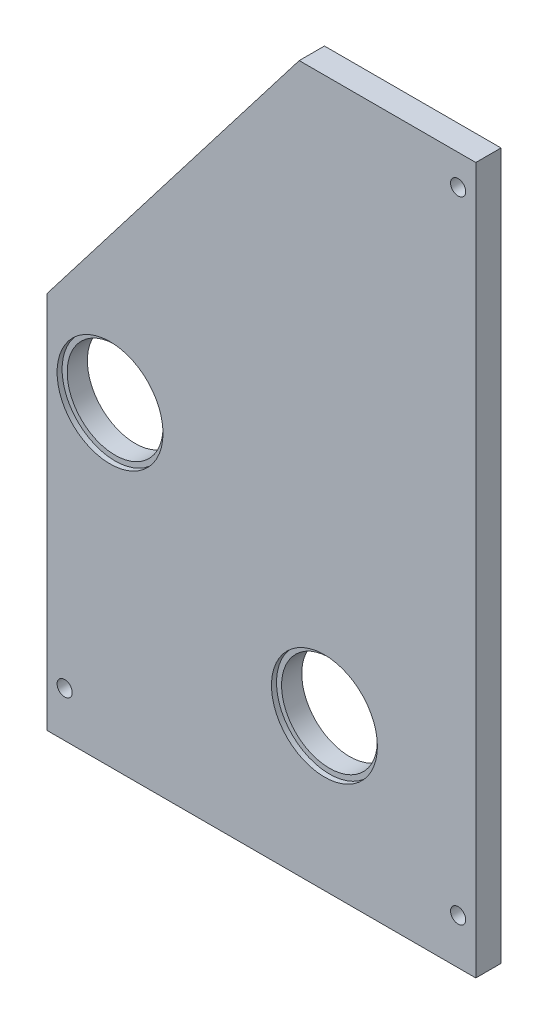
ISO-10303-21;
HEADER;
FILE_DESCRIPTION(('STEP AP214'),'2;1');
FILE_NAME('part.step','',(''),(''),'','','');
FILE_SCHEMA(('AUTOMOTIVE_DESIGN { 1 0 10303 214 1 1 1 1 }'));
ENDSEC;
DATA;
#1=APPLICATION_CONTEXT('core data for automotive mechanical design processes');
#2=APPLICATION_PROTOCOL_DEFINITION('international standard','automotive_design',2000,#1);
#3=PRODUCT_CONTEXT('',#1,'mechanical');
#4=PRODUCT('Part','Part','',(#3));
#5=PRODUCT_RELATED_PRODUCT_CATEGORY('part','',(#4));
#6=PRODUCT_DEFINITION_FORMATION('','',#4);
#7=PRODUCT_DEFINITION_CONTEXT('part definition',#1,'design');
#8=PRODUCT_DEFINITION('design','',#6,#7);
#9=PRODUCT_DEFINITION_SHAPE('','',#8);
#10=(LENGTH_UNIT() NAMED_UNIT(*) SI_UNIT(.MILLI.,.METRE.));
#11=(NAMED_UNIT(*) PLANE_ANGLE_UNIT() SI_UNIT($,.RADIAN.));
#12=(NAMED_UNIT(*) SI_UNIT($,.STERADIAN.) SOLID_ANGLE_UNIT());
#13=UNCERTAINTY_MEASURE_WITH_UNIT(LENGTH_MEASURE(1.E-05),#10,'distance_accuracy_value','');
#14=(GEOMETRIC_REPRESENTATION_CONTEXT(3) GLOBAL_UNCERTAINTY_ASSIGNED_CONTEXT((#13)) GLOBAL_UNIT_ASSIGNED_CONTEXT((#10,
#11,#12)) REPRESENTATION_CONTEXT('',''));
#15=CARTESIAN_POINT('',(0.,0.,0.));
#16=DIRECTION('',(0.,0.,1.));
#17=DIRECTION('',(1.,0.,0.));
#18=AXIS2_PLACEMENT_3D('',#15,#16,#17);
#19=CARTESIAN_POINT('',(30.,30.,-26.8700576850888));
#20=DIRECTION('',(0.,0.,1.));
#21=DIRECTION('',(1.,0.,0.));
#22=AXIS2_PLACEMENT_3D('',#19,#20,#21);
#23=CYLINDRICAL_SURFACE('',#22,9.5);
#24=CARTESIAN_POINT('',(30.,30.,0.));
#25=DIRECTION('',(0.,0.,1.));
#26=DIRECTION('',(1.,0.,0.));
#27=AXIS2_PLACEMENT_3D('',#24,#25,#26);
#28=CIRCLE('',#27,9.5);
#29=CARTESIAN_POINT('',(39.5,30.,0.));
#30=VERTEX_POINT('',#29);
#31=EDGE_CURVE('E227',#30,#30,#28,.F.);
#32=ORIENTED_EDGE('',*,*,#31,.T.);
#33=EDGE_LOOP('',(#32));
#34=FACE_BOUND('',#33,.T.);
#35=CARTESIAN_POINT('',(30.,30.,4.));
#36=DIRECTION('',(0.,0.,1.));
#37=DIRECTION('',(1.,0.,0.));
#38=AXIS2_PLACEMENT_3D('',#35,#36,#37);
#39=CIRCLE('',#38,9.5);
#40=CARTESIAN_POINT('',(39.5,30.,4.));
#41=VERTEX_POINT('',#40);
#42=EDGE_CURVE('E238',#41,#41,#39,.T.);
#43=ORIENTED_EDGE('',*,*,#42,.T.);
#44=EDGE_LOOP('',(#43));
#45=FACE_BOUND('',#44,.T.);
#46=ADVANCED_FACE('F43',(#34,#45),#23,.F.);
#47=CARTESIAN_POINT('',(0.,140.,5.));
#48=DIRECTION('',(0.,1.,0.));
#49=DIRECTION('',(0.,0.,1.));
#50=AXIS2_PLACEMENT_3D('',#47,#48,#49);
#51=PLANE('',#50);
#52=DIRECTION('',(1.,0.,0.));
#53=VECTOR('',#52,1.);
#54=CARTESIAN_POINT('',(0.,140.,0.));
#55=LINE('',#54,#53);
#56=CARTESIAN_POINT('',(25.,140.,0.));
#57=VERTEX_POINT('',#56);
#58=CARTESIAN_POINT('',(60.,140.,0.));
#59=VERTEX_POINT('',#58);
#60=EDGE_CURVE('E132',#57,#59,#55,.T.);
#61=ORIENTED_EDGE('',*,*,#60,.F.);
#62=DIRECTION('',(0.,0.,-1.));
#63=VECTOR('',#62,1.);
#64=CARTESIAN_POINT('',(25.,140.,5.));
#65=LINE('',#64,#63);
#66=CARTESIAN_POINT('',(25.,140.,5.));
#67=VERTEX_POINT('',#66);
#68=EDGE_CURVE('E52',#67,#57,#65,.T.);
#69=ORIENTED_EDGE('',*,*,#68,.F.);
#70=DIRECTION('',(1.,0.,0.));
#71=VECTOR('',#70,1.);
#72=CARTESIAN_POINT('',(0.,140.,5.));
#73=LINE('',#72,#71);
#74=CARTESIAN_POINT('',(60.,140.,5.));
#75=VERTEX_POINT('',#74);
#76=EDGE_CURVE('E153',#67,#75,#73,.T.);
#77=ORIENTED_EDGE('',*,*,#76,.T.);
#78=DIRECTION('',(0.,0.,-1.));
#79=VECTOR('',#78,1.);
#80=CARTESIAN_POINT('',(60.,140.,5.));
#81=LINE('',#80,#79);
#82=EDGE_CURVE('E60',#75,#59,#81,.T.);
#83=ORIENTED_EDGE('',*,*,#82,.T.);
#84=EDGE_LOOP('',(#61,#69,#77,#83));
#85=FACE_BOUND('',#84,.T.);
#86=ADVANCED_FACE('F45',(#85),#51,.T.);
#87=CARTESIAN_POINT('',(-51.9516728624535,39.9628252788104,5.));
#88=DIRECTION('',(-0.7926239891046,0.609710760849692,0.));
#89=DIRECTION('',(-0.609710760849692,-0.7926239891046,0.));
#90=AXIS2_PLACEMENT_3D('',#87,#88,#89);
#91=PLANE('',#90);
#92=DIRECTION('',(0.609710760849692,0.7926239891046,0.));
#93=VECTOR('',#92,1.);
#94=CARTESIAN_POINT('',(-51.9516728624535,39.9628252788104,0.));
#95=LINE('',#94,#93);
#96=CARTESIAN_POINT('',(-25.,75.,0.));
#97=VERTEX_POINT('',#96);
#98=EDGE_CURVE('E134',#97,#57,#95,.T.);
#99=ORIENTED_EDGE('',*,*,#98,.F.);
#100=DIRECTION('',(0.,0.,-1.));
#101=VECTOR('',#100,1.);
#102=CARTESIAN_POINT('',(-25.,75.,5.));
#103=LINE('',#102,#101);
#104=CARTESIAN_POINT('',(-25.,75.,5.));
#105=VERTEX_POINT('',#104);
#106=EDGE_CURVE('E102',#105,#97,#103,.T.);
#107=ORIENTED_EDGE('',*,*,#106,.F.);
#108=DIRECTION('',(0.609710760849692,0.7926239891046,0.));
#109=VECTOR('',#108,1.);
#110=CARTESIAN_POINT('',(-51.9516728624535,39.9628252788104,5.));
#111=LINE('',#110,#109);
#112=EDGE_CURVE('E112',#105,#67,#111,.T.);
#113=ORIENTED_EDGE('',*,*,#112,.T.);
#114=ORIENTED_EDGE('',*,*,#68,.T.);
#115=EDGE_LOOP('',(#99,#107,#113,#114));
#116=FACE_BOUND('',#115,.T.);
#117=ADVANCED_FACE('F158',(#116),#91,.T.);
#118=CARTESIAN_POINT('',(-25.,0.,5.));
#119=DIRECTION('',(-1.,0.,0.));
#120=DIRECTION('',(0.,0.,1.));
#121=AXIS2_PLACEMENT_3D('',#118,#119,#120);
#122=PLANE('',#121);
#123=DIRECTION('',(0.,1.,0.));
#124=VECTOR('',#123,1.);
#125=CARTESIAN_POINT('',(-25.,0.,0.));
#126=LINE('',#125,#124);
#127=CARTESIAN_POINT('',(-25.,0.,0.));
#128=VERTEX_POINT('',#127);
#129=EDGE_CURVE('E98',#128,#97,#126,.T.);
#130=ORIENTED_EDGE('',*,*,#129,.F.);
#131=DIRECTION('',(0.,0.,-1.));
#132=VECTOR('',#131,1.);
#133=CARTESIAN_POINT('',(-25.,0.,5.));
#134=LINE('',#133,#132);
#135=CARTESIAN_POINT('',(-25.,0.,5.));
#136=VERTEX_POINT('',#135);
#137=EDGE_CURVE('E93',#136,#128,#134,.T.);
#138=ORIENTED_EDGE('',*,*,#137,.F.);
#139=DIRECTION('',(0.,1.,0.));
#140=VECTOR('',#139,1.);
#141=CARTESIAN_POINT('',(-25.,0.,5.));
#142=LINE('',#141,#140);
#143=EDGE_CURVE('E96',#136,#105,#142,.T.);
#144=ORIENTED_EDGE('',*,*,#143,.T.);
#145=ORIENTED_EDGE('',*,*,#106,.T.);
#146=EDGE_LOOP('',(#130,#138,#144,#145));
#147=FACE_BOUND('',#146,.T.);
#148=ADVANCED_FACE('F95',(#147),#122,.T.);
#149=CARTESIAN_POINT('',(0.,0.,5.));
#150=DIRECTION('',(0.,-1.,0.));
#151=DIRECTION('',(1.,0.,0.));
#152=AXIS2_PLACEMENT_3D('',#149,#150,#151);
#153=PLANE('',#152);
#154=DIRECTION('',(-1.,0.,0.));
#155=VECTOR('',#154,1.);
#156=CARTESIAN_POINT('',(0.,0.,0.));
#157=LINE('',#156,#155);
#158=CARTESIAN_POINT('',(60.,0.,0.));
#159=VERTEX_POINT('',#158);
#160=EDGE_CURVE('E139',#159,#128,#157,.T.);
#161=ORIENTED_EDGE('',*,*,#160,.F.);
#162=DIRECTION('',(0.,0.,-1.));
#163=VECTOR('',#162,1.);
#164=CARTESIAN_POINT('',(60.,0.,5.));
#165=LINE('',#164,#163);
#166=CARTESIAN_POINT('',(60.,0.,5.));
#167=VERTEX_POINT('',#166);
#168=EDGE_CURVE('E77',#167,#159,#165,.T.);
#169=ORIENTED_EDGE('',*,*,#168,.F.);
#170=DIRECTION('',(-1.,0.,0.));
#171=VECTOR('',#170,1.);
#172=CARTESIAN_POINT('',(0.,0.,5.));
#173=LINE('',#172,#171);
#174=EDGE_CURVE('E110',#167,#136,#173,.T.);
#175=ORIENTED_EDGE('',*,*,#174,.T.);
#176=ORIENTED_EDGE('',*,*,#137,.T.);
#177=EDGE_LOOP('',(#161,#169,#175,#176));
#178=FACE_BOUND('',#177,.T.);
#179=ADVANCED_FACE('F114',(#178),#153,.T.);
#180=CARTESIAN_POINT('',(56.5,9.00000000000001,5.));
#181=DIRECTION('',(0.,0.,-1.));
#182=DIRECTION('',(-1.,0.,0.));
#183=AXIS2_PLACEMENT_3D('',#180,#181,#182);
#184=CYLINDRICAL_SURFACE('',#183,1.5);
#185=CARTESIAN_POINT('',(56.5,9.00000000000001,5.));
#186=DIRECTION('',(0.,0.,1.));
#187=DIRECTION('',(1.,0.,0.));
#188=AXIS2_PLACEMENT_3D('',#185,#186,#187);
#189=CIRCLE('',#188,1.5);
#190=CARTESIAN_POINT('',(58.,9.00000000000001,5.));
#191=VERTEX_POINT('',#190);
#192=EDGE_CURVE('E126',#191,#191,#189,.T.);
#193=ORIENTED_EDGE('',*,*,#192,.T.);
#194=EDGE_LOOP('',(#193));
#195=FACE_BOUND('',#194,.T.);
#196=CARTESIAN_POINT('',(56.5,9.00000000000001,0.));
#197=DIRECTION('',(0.,0.,1.));
#198=DIRECTION('',(1.,0.,0.));
#199=AXIS2_PLACEMENT_3D('',#196,#197,#198);
#200=CIRCLE('',#199,1.5);
#201=CARTESIAN_POINT('',(58.,9.00000000000001,0.));
#202=VERTEX_POINT('',#201);
#203=EDGE_CURVE('E147',#202,#202,#200,.T.);
#204=ORIENTED_EDGE('',*,*,#203,.F.);
#205=EDGE_LOOP('',(#204));
#206=FACE_BOUND('',#205,.T.);
#207=ADVANCED_FACE('F203',(#195,#206),#184,.F.);
#208=CARTESIAN_POINT('',(-12.5,62.5,5.));
#209=DIRECTION('',(0.,0.,-1.));
#210=DIRECTION('',(-1.,0.,0.));
#211=AXIS2_PLACEMENT_3D('',#208,#209,#210);
#212=CYLINDRICAL_SURFACE('',#211,10.5);
#213=CARTESIAN_POINT('',(-12.5,62.5,4.));
#214=DIRECTION('',(0.,0.,1.));
#215=DIRECTION('',(1.,0.,0.));
#216=AXIS2_PLACEMENT_3D('',#213,#214,#215);
#217=CIRCLE('',#216,10.5);
#218=CARTESIAN_POINT('',(-2.,62.5,4.));
#219=VERTEX_POINT('',#218);
#220=EDGE_CURVE('E11',#219,#219,#217,.T.);
#221=ORIENTED_EDGE('',*,*,#220,.F.);
#222=EDGE_LOOP('',(#221));
#223=FACE_BOUND('',#222,.T.);
#224=CARTESIAN_POINT('',(-12.5,62.5,5.));
#225=DIRECTION('',(0.,0.,1.));
#226=DIRECTION('',(1.,0.,0.));
#227=AXIS2_PLACEMENT_3D('',#224,#225,#226);
#228=CIRCLE('',#227,10.5);
#229=CARTESIAN_POINT('',(-2.,62.5,5.));
#230=VERTEX_POINT('',#229);
#231=EDGE_CURVE('E123',#230,#230,#228,.T.);
#232=ORIENTED_EDGE('',*,*,#231,.T.);
#233=EDGE_LOOP('',(#232));
#234=FACE_BOUND('',#233,.T.);
#235=ADVANCED_FACE('F173',(#223,#234),#212,.F.);
#236=CARTESIAN_POINT('',(-21.5,9.00000000000001,5.));
#237=DIRECTION('',(0.,0.,-1.));
#238=DIRECTION('',(-1.,0.,0.));
#239=AXIS2_PLACEMENT_3D('',#236,#237,#238);
#240=CYLINDRICAL_SURFACE('',#239,1.5);
#241=CARTESIAN_POINT('',(-21.5,9.00000000000001,5.));
#242=DIRECTION('',(0.,0.,1.));
#243=DIRECTION('',(1.,0.,0.));
#244=AXIS2_PLACEMENT_3D('',#241,#242,#243);
#245=CIRCLE('',#244,1.5);
#246=CARTESIAN_POINT('',(-20.,9.00000000000001,5.));
#247=VERTEX_POINT('',#246);
#248=EDGE_CURVE('E117',#247,#247,#245,.T.);
#249=ORIENTED_EDGE('',*,*,#248,.T.);
#250=EDGE_LOOP('',(#249));
#251=FACE_BOUND('',#250,.T.);
#252=CARTESIAN_POINT('',(-21.5,9.00000000000001,0.));
#253=DIRECTION('',(0.,0.,1.));
#254=DIRECTION('',(1.,0.,0.));
#255=AXIS2_PLACEMENT_3D('',#252,#253,#254);
#256=CIRCLE('',#255,1.5);
#257=CARTESIAN_POINT('',(-20.,9.00000000000001,0.));
#258=VERTEX_POINT('',#257);
#259=EDGE_CURVE('E144',#258,#258,#256,.T.);
#260=ORIENTED_EDGE('',*,*,#259,.F.);
#261=EDGE_LOOP('',(#260));
#262=FACE_BOUND('',#261,.T.);
#263=ADVANCED_FACE('F165',(#251,#262),#240,.F.);
#264=CARTESIAN_POINT('',(60.,0.,5.));
#265=DIRECTION('',(1.,0.,0.));
#266=DIRECTION('',(0.,1.,0.));
#267=AXIS2_PLACEMENT_3D('',#264,#265,#266);
#268=PLANE('',#267);
#269=DIRECTION('',(0.,-1.,0.));
#270=VECTOR('',#269,1.);
#271=CARTESIAN_POINT('',(60.,0.,0.));
#272=LINE('',#271,#270);
#273=EDGE_CURVE('E141',#59,#159,#272,.T.);
#274=ORIENTED_EDGE('',*,*,#273,.F.);
#275=ORIENTED_EDGE('',*,*,#82,.F.);
#276=DIRECTION('',(0.,-1.,0.));
#277=VECTOR('',#276,1.);
#278=CARTESIAN_POINT('',(60.,0.,5.));
#279=LINE('',#278,#277);
#280=EDGE_CURVE('E115',#75,#167,#279,.T.);
#281=ORIENTED_EDGE('',*,*,#280,.T.);
#282=ORIENTED_EDGE('',*,*,#168,.T.);
#283=EDGE_LOOP('',(#274,#275,#281,#282));
#284=FACE_BOUND('',#283,.T.);
#285=ADVANCED_FACE('F162',(#284),#268,.T.);
#286=CARTESIAN_POINT('',(56.5,134.,5.));
#287=DIRECTION('',(0.,0.,-1.));
#288=DIRECTION('',(-1.,0.,0.));
#289=AXIS2_PLACEMENT_3D('',#286,#287,#288);
#290=CYLINDRICAL_SURFACE('',#289,1.5);
#291=CARTESIAN_POINT('',(56.5,134.,5.));
#292=DIRECTION('',(0.,0.,1.));
#293=DIRECTION('',(1.,0.,0.));
#294=AXIS2_PLACEMENT_3D('',#291,#292,#293);
#295=CIRCLE('',#294,1.5);
#296=CARTESIAN_POINT('',(58.,134.,5.));
#297=VERTEX_POINT('',#296);
#298=EDGE_CURVE('E129',#297,#297,#295,.T.);
#299=ORIENTED_EDGE('',*,*,#298,.T.);
#300=EDGE_LOOP('',(#299));
#301=FACE_BOUND('',#300,.T.);
#302=CARTESIAN_POINT('',(56.5,134.,0.));
#303=DIRECTION('',(0.,0.,1.));
#304=DIRECTION('',(1.,0.,0.));
#305=AXIS2_PLACEMENT_3D('',#302,#303,#304);
#306=CIRCLE('',#305,1.5);
#307=CARTESIAN_POINT('',(58.,134.,0.));
#308=VERTEX_POINT('',#307);
#309=EDGE_CURVE('E150',#308,#308,#306,.T.);
#310=ORIENTED_EDGE('',*,*,#309,.F.);
#311=EDGE_LOOP('',(#310));
#312=FACE_BOUND('',#311,.T.);
#313=ADVANCED_FACE('F164',(#301,#312),#290,.F.);
#314=CARTESIAN_POINT('',(0.,0.,5.));
#315=DIRECTION('',(0.,0.,1.));
#316=DIRECTION('',(1.,0.,0.));
#317=AXIS2_PLACEMENT_3D('',#314,#315,#316);
#318=PLANE('',#317);
#319=CARTESIAN_POINT('',(30.,30.,5.));
#320=DIRECTION('',(0.,0.,1.));
#321=DIRECTION('',(1.,0.,0.));
#322=AXIS2_PLACEMENT_3D('',#319,#320,#321);
#323=CIRCLE('',#322,10.5);
#324=CARTESIAN_POINT('',(40.5,30.,5.));
#325=VERTEX_POINT('',#324);
#326=EDGE_CURVE('E235',#325,#325,#323,.T.);
#327=ORIENTED_EDGE('',*,*,#326,.F.);
#328=EDGE_LOOP('',(#327));
#329=FACE_BOUND('',#328,.T.);
#330=ORIENTED_EDGE('',*,*,#76,.F.);
#331=ORIENTED_EDGE('',*,*,#112,.F.);
#332=ORIENTED_EDGE('',*,*,#143,.F.);
#333=ORIENTED_EDGE('',*,*,#174,.F.);
#334=ORIENTED_EDGE('',*,*,#280,.F.);
#335=EDGE_LOOP('',(#330,#331,#332,#333,#334));
#336=FACE_BOUND('',#335,.T.);
#337=ORIENTED_EDGE('',*,*,#248,.F.);
#338=EDGE_LOOP('',(#337));
#339=FACE_BOUND('',#338,.T.);
#340=ORIENTED_EDGE('',*,*,#231,.F.);
#341=EDGE_LOOP('',(#340));
#342=FACE_BOUND('',#341,.T.);
#343=ORIENTED_EDGE('',*,*,#192,.F.);
#344=EDGE_LOOP('',(#343));
#345=FACE_BOUND('',#344,.T.);
#346=ORIENTED_EDGE('',*,*,#298,.F.);
#347=EDGE_LOOP('',(#346));
#348=FACE_BOUND('',#347,.T.);
#349=ADVANCED_FACE('F107',(#329,#336,#339,#342,#345,#348),#318,.T.);
#350=CARTESIAN_POINT('',(0.,0.,0.));
#351=DIRECTION('',(0.,0.,1.));
#352=DIRECTION('',(1.,0.,0.));
#353=AXIS2_PLACEMENT_3D('',#350,#351,#352);
#354=PLANE('',#353);
#355=ORIENTED_EDGE('',*,*,#31,.F.);
#356=EDGE_LOOP('',(#355));
#357=FACE_BOUND('',#356,.T.);
#358=ORIENTED_EDGE('',*,*,#60,.T.);
#359=ORIENTED_EDGE('',*,*,#273,.T.);
#360=ORIENTED_EDGE('',*,*,#160,.T.);
#361=ORIENTED_EDGE('',*,*,#129,.T.);
#362=ORIENTED_EDGE('',*,*,#98,.T.);
#363=EDGE_LOOP('',(#358,#359,#360,#361,#362));
#364=FACE_BOUND('',#363,.T.);
#365=ORIENTED_EDGE('',*,*,#259,.T.);
#366=EDGE_LOOP('',(#365));
#367=FACE_BOUND('',#366,.T.);
#368=ORIENTED_EDGE('',*,*,#203,.T.);
#369=EDGE_LOOP('',(#368));
#370=FACE_BOUND('',#369,.T.);
#371=ORIENTED_EDGE('',*,*,#309,.T.);
#372=EDGE_LOOP('',(#371));
#373=FACE_BOUND('',#372,.T.);
#374=CARTESIAN_POINT('',(-12.5,62.5,0.));
#375=DIRECTION('',(0.,0.,1.));
#376=DIRECTION('',(1.,0.,0.));
#377=AXIS2_PLACEMENT_3D('',#374,#375,#376);
#378=CIRCLE('',#377,9.5);
#379=CARTESIAN_POINT('',(-3.,62.5,0.));
#380=VERTEX_POINT('',#379);
#381=EDGE_CURVE('E225',#380,#380,#378,.T.);
#382=ORIENTED_EDGE('',*,*,#381,.T.);
#383=EDGE_LOOP('',(#382));
#384=FACE_BOUND('',#383,.T.);
#385=ADVANCED_FACE('F160',(#357,#364,#367,#370,#373,#384),#354,.F.);
#386=CARTESIAN_POINT('',(-12.5,62.5,4.));
#387=DIRECTION('',(0.,0.,-1.));
#388=DIRECTION('',(-1.,0.,0.));
#389=AXIS2_PLACEMENT_3D('',#386,#387,#388);
#390=CYLINDRICAL_SURFACE('',#389,9.5);
#391=CARTESIAN_POINT('',(-12.5,62.5,4.));
#392=DIRECTION('',(0.,0.,1.));
#393=DIRECTION('',(1.,0.,0.));
#394=AXIS2_PLACEMENT_3D('',#391,#392,#393);
#395=CIRCLE('',#394,9.5);
#396=CARTESIAN_POINT('',(-3.,62.5,4.));
#397=VERTEX_POINT('',#396);
#398=EDGE_CURVE('E135',#397,#397,#395,.T.);
#399=ORIENTED_EDGE('',*,*,#398,.T.);
#400=EDGE_LOOP('',(#399));
#401=FACE_BOUND('',#400,.T.);
#402=ORIENTED_EDGE('',*,*,#381,.F.);
#403=EDGE_LOOP('',(#402));
#404=FACE_BOUND('',#403,.T.);
#405=ADVANCED_FACE('F192',(#401,#404),#390,.F.);
#406=CARTESIAN_POINT('',(0.,0.,4.));
#407=DIRECTION('',(0.,0.,1.));
#408=DIRECTION('',(1.,0.,0.));
#409=AXIS2_PLACEMENT_3D('',#406,#407,#408);
#410=PLANE('',#409);
#411=ORIENTED_EDGE('',*,*,#398,.F.);
#412=EDGE_LOOP('',(#411));
#413=FACE_BOUND('',#412,.T.);
#414=ORIENTED_EDGE('',*,*,#220,.T.);
#415=EDGE_LOOP('',(#414));
#416=FACE_BOUND('',#415,.T.);
#417=ADVANCED_FACE('F189',(#413,#416),#410,.T.);
#418=CARTESIAN_POINT('',(30.,30.,4.));
#419=DIRECTION('',(0.,0.,1.));
#420=DIRECTION('',(1.,0.,0.));
#421=AXIS2_PLACEMENT_3D('',#418,#419,#420);
#422=CYLINDRICAL_SURFACE('',#421,10.5);
#423=CARTESIAN_POINT('',(30.,30.,4.));
#424=DIRECTION('',(0.,0.,1.));
#425=DIRECTION('',(1.,0.,0.));
#426=AXIS2_PLACEMENT_3D('',#423,#424,#425);
#427=CIRCLE('',#426,10.5);
#428=CARTESIAN_POINT('',(40.5,30.,4.));
#429=VERTEX_POINT('',#428);
#430=EDGE_CURVE('E231',#429,#429,#427,.T.);
#431=ORIENTED_EDGE('',*,*,#430,.F.);
#432=EDGE_LOOP('',(#431));
#433=FACE_BOUND('',#432,.T.);
#434=ORIENTED_EDGE('',*,*,#326,.T.);
#435=EDGE_LOOP('',(#434));
#436=FACE_BOUND('',#435,.T.);
#437=ADVANCED_FACE('F187',(#433,#436),#422,.F.);
#438=CARTESIAN_POINT('',(0.,0.,4.));
#439=DIRECTION('',(0.,0.,1.));
#440=DIRECTION('',(1.,0.,0.));
#441=AXIS2_PLACEMENT_3D('',#438,#439,#440);
#442=PLANE('',#441);
#443=ORIENTED_EDGE('',*,*,#42,.F.);
#444=EDGE_LOOP('',(#443));
#445=FACE_BOUND('',#444,.T.);
#446=ORIENTED_EDGE('',*,*,#430,.T.);
#447=EDGE_LOOP('',(#446));
#448=FACE_BOUND('',#447,.T.);
#449=ADVANCED_FACE('F244',(#445,#448),#442,.T.);
#450=CLOSED_SHELL('',(#46,#86,#117,#148,#179,#207,#235,#263,#285,#313,#349,#385,#405,#417,#437,#449));
#451=MANIFOLD_SOLID_BREP('B2',#450);
#452=ADVANCED_BREP_SHAPE_REPRESENTATION('',(#18,#451),#14);
#453=SHAPE_DEFINITION_REPRESENTATION(#9,#452);
ENDSEC;
END-ISO-10303-21;
